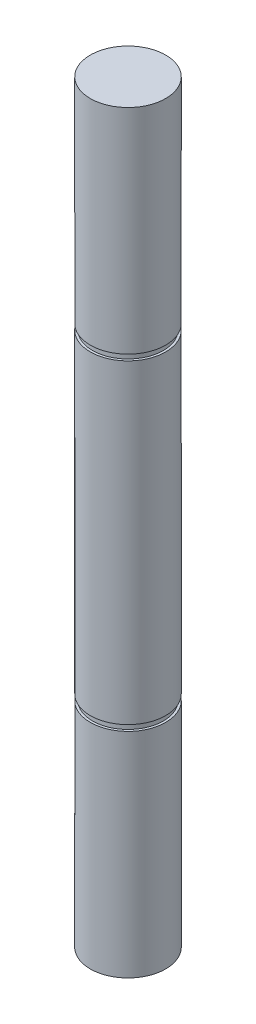
ISO-10303-21;
HEADER;
FILE_DESCRIPTION(('STEP AP214'),'2;1');
FILE_NAME('part.step','',(''),(''),'','','');
FILE_SCHEMA(('AUTOMOTIVE_DESIGN { 1 0 10303 214 1 1 1 1 }'));
ENDSEC;
DATA;
#1=APPLICATION_CONTEXT('core data for automotive mechanical design processes');
#2=APPLICATION_PROTOCOL_DEFINITION('international standard','automotive_design',2000,#1);
#3=PRODUCT_CONTEXT('',#1,'mechanical');
#4=PRODUCT('Part','Part','',(#3));
#5=PRODUCT_RELATED_PRODUCT_CATEGORY('part','',(#4));
#6=PRODUCT_DEFINITION_FORMATION('','',#4);
#7=PRODUCT_DEFINITION_CONTEXT('part definition',#1,'design');
#8=PRODUCT_DEFINITION('design','',#6,#7);
#9=PRODUCT_DEFINITION_SHAPE('','',#8);
#10=(LENGTH_UNIT() NAMED_UNIT(*) SI_UNIT(.MILLI.,.METRE.));
#11=(NAMED_UNIT(*) PLANE_ANGLE_UNIT() SI_UNIT($,.RADIAN.));
#12=(NAMED_UNIT(*) SI_UNIT($,.STERADIAN.) SOLID_ANGLE_UNIT());
#13=UNCERTAINTY_MEASURE_WITH_UNIT(LENGTH_MEASURE(1.E-05),#10,'distance_accuracy_value','');
#14=(GEOMETRIC_REPRESENTATION_CONTEXT(3) GLOBAL_UNCERTAINTY_ASSIGNED_CONTEXT((#13)) GLOBAL_UNIT_ASSIGNED_CONTEXT((#10,
#11,#12)) REPRESENTATION_CONTEXT('',''));
#15=CARTESIAN_POINT('',(0.,0.,0.));
#16=DIRECTION('',(0.,0.,1.));
#17=DIRECTION('',(1.,0.,0.));
#18=AXIS2_PLACEMENT_3D('',#15,#16,#17);
#19=CARTESIAN_POINT('',(0.,-95.25,0.));
#20=DIRECTION('',(0.,1.,0.));
#21=DIRECTION('',(0.,0.,1.));
#22=AXIS2_PLACEMENT_3D('',#19,#20,#21);
#23=CYLINDRICAL_SURFACE('',#22,4.7625);
#24=CARTESIAN_POINT('',(0.,-95.25,0.));
#25=DIRECTION('',(0.,1.,0.));
#26=DIRECTION('',(0.,0.,1.));
#27=AXIS2_PLACEMENT_3D('',#24,#25,#26);
#28=CIRCLE('',#27,4.7625);
#29=CARTESIAN_POINT('',(0.,-95.25,4.7625));
#30=VERTEX_POINT('',#29);
#31=EDGE_CURVE('E96',#30,#30,#28,.T.);
#32=ORIENTED_EDGE('',*,*,#31,.T.);
#33=EDGE_LOOP('',(#32));
#34=FACE_BOUND('',#33,.T.);
#35=CARTESIAN_POINT('',(0.,-68.2625,0.));
#36=DIRECTION('',(0.,1.,0.));
#37=DIRECTION('',(-1.,0.,0.));
#38=AXIS2_PLACEMENT_3D('',#35,#36,#37);
#39=CIRCLE('',#38,4.7625);
#40=CARTESIAN_POINT('',(-4.7625,-68.2624999999999,0.));
#41=VERTEX_POINT('',#40);
#42=EDGE_CURVE('E102',#41,#41,#39,.F.);
#43=ORIENTED_EDGE('',*,*,#42,.T.);
#44=EDGE_LOOP('',(#43));
#45=FACE_BOUND('',#44,.T.);
#46=ADVANCED_FACE('F73',(#34,#45),#23,.T.);
#47=CARTESIAN_POINT('',(0.,-95.25,0.));
#48=DIRECTION('',(0.,1.,0.));
#49=DIRECTION('',(0.,0.,1.));
#50=AXIS2_PLACEMENT_3D('',#47,#48,#49);
#51=PLANE('',#50);
#52=ORIENTED_EDGE('',*,*,#31,.F.);
#53=EDGE_LOOP('',(#52));
#54=FACE_BOUND('',#53,.T.);
#55=ADVANCED_FACE('F120',(#54),#51,.F.);
#56=CARTESIAN_POINT('',(-2.32535508070437E-13,-68.2625,0.));
#57=DIRECTION('',(0.,1.,0.));
#58=DIRECTION('',(-1.,0.,0.));
#59=AXIS2_PLACEMENT_3D('',#56,#57,#58);
#60=PLANE('',#59);
#61=CARTESIAN_POINT('',(0.,-68.2625,0.));
#62=DIRECTION('',(0.,1.,0.));
#63=DIRECTION('',(0.,0.,1.));
#64=AXIS2_PLACEMENT_3D('',#61,#62,#63);
#65=CIRCLE('',#64,4.47039999999978);
#66=CARTESIAN_POINT('',(0.,-68.2625,4.47039999999978));
#67=VERTEX_POINT('',#66);
#68=EDGE_CURVE('E106',#67,#67,#65,.T.);
#69=ORIENTED_EDGE('',*,*,#68,.F.);
#70=EDGE_LOOP('',(#69));
#71=FACE_BOUND('',#70,.T.);
#72=ORIENTED_EDGE('',*,*,#42,.F.);
#73=EDGE_LOOP('',(#72));
#74=FACE_BOUND('',#73,.T.);
#75=ADVANCED_FACE('F117',(#71,#74),#60,.T.);
#76=CARTESIAN_POINT('',(0.,-54.8816993815352,0.));
#77=DIRECTION('',(0.,-1.,0.));
#78=DIRECTION('',(0.,0.,-1.));
#79=AXIS2_PLACEMENT_3D('',#76,#77,#78);
#80=CYLINDRICAL_SURFACE('',#79,4.47039999999978);
#81=ORIENTED_EDGE('',*,*,#68,.T.);
#82=EDGE_LOOP('',(#81));
#83=FACE_BOUND('',#82,.T.);
#84=CARTESIAN_POINT('',(0.,-67.5259,0.));
#85=DIRECTION('',(0.,1.,0.));
#86=DIRECTION('',(-1.,0.,0.));
#87=AXIS2_PLACEMENT_3D('',#84,#85,#86);
#88=CIRCLE('',#87,4.47039999999978);
#89=CARTESIAN_POINT('',(-4.47039999999978,-67.5259,0.));
#90=VERTEX_POINT('',#89);
#91=EDGE_CURVE('E107',#90,#90,#88,.T.);
#92=ORIENTED_EDGE('',*,*,#91,.F.);
#93=EDGE_LOOP('',(#92));
#94=FACE_BOUND('',#93,.T.);
#95=ADVANCED_FACE('F114',(#83,#94),#80,.T.);
#96=CARTESIAN_POINT('',(0.,-95.25,0.));
#97=DIRECTION('',(0.,1.,0.));
#98=DIRECTION('',(0.,0.,1.));
#99=AXIS2_PLACEMENT_3D('',#96,#97,#98);
#100=CYLINDRICAL_SURFACE('',#99,4.7625);
#101=CARTESIAN_POINT('',(0.,-27.7241,0.));
#102=DIRECTION('',(0.,-1.,0.));
#103=DIRECTION('',(0.,0.,-1.));
#104=AXIS2_PLACEMENT_3D('',#101,#102,#103);
#105=CIRCLE('',#104,4.7625);
#106=CARTESIAN_POINT('',(0.,-27.7241,-4.7625));
#107=VERTEX_POINT('',#106);
#108=EDGE_CURVE('E82',#107,#107,#105,.F.);
#109=ORIENTED_EDGE('',*,*,#108,.F.);
#110=EDGE_LOOP('',(#109));
#111=FACE_BOUND('',#110,.T.);
#112=CARTESIAN_POINT('',(0.,-67.5259,0.));
#113=DIRECTION('',(0.,1.,0.));
#114=DIRECTION('',(-1.,0.,0.));
#115=AXIS2_PLACEMENT_3D('',#112,#113,#114);
#116=CIRCLE('',#115,4.7625);
#117=CARTESIAN_POINT('',(-4.7625,-67.5259,0.));
#118=VERTEX_POINT('',#117);
#119=EDGE_CURVE('E77',#118,#118,#116,.F.);
#120=ORIENTED_EDGE('',*,*,#119,.F.);
#121=EDGE_LOOP('',(#120));
#122=FACE_BOUND('',#121,.T.);
#123=ADVANCED_FACE('F75',(#111,#122),#100,.T.);
#124=CARTESIAN_POINT('',(-2.32535508070437E-13,-67.5259,0.));
#125=DIRECTION('',(0.,1.,0.));
#126=DIRECTION('',(-1.,0.,0.));
#127=AXIS2_PLACEMENT_3D('',#124,#125,#126);
#128=PLANE('',#127);
#129=ORIENTED_EDGE('',*,*,#91,.T.);
#130=EDGE_LOOP('',(#129));
#131=FACE_BOUND('',#130,.T.);
#132=ORIENTED_EDGE('',*,*,#119,.T.);
#133=EDGE_LOOP('',(#132));
#134=FACE_BOUND('',#133,.T.);
#135=ADVANCED_FACE('F138',(#131,#134),#128,.F.);
#136=CARTESIAN_POINT('',(0.,-27.7241,0.));
#137=DIRECTION('',(0.,-1.,0.));
#138=DIRECTION('',(0.,0.,-1.));
#139=AXIS2_PLACEMENT_3D('',#136,#137,#138);
#140=PLANE('',#139);
#141=CARTESIAN_POINT('',(0.,-27.7241,0.));
#142=DIRECTION('',(0.,1.,0.));
#143=DIRECTION('',(0.,0.,1.));
#144=AXIS2_PLACEMENT_3D('',#141,#142,#143);
#145=CIRCLE('',#144,4.4704);
#146=CARTESIAN_POINT('',(0.,-27.7241,4.4704));
#147=VERTEX_POINT('',#146);
#148=EDGE_CURVE('E11',#147,#147,#145,.T.);
#149=ORIENTED_EDGE('',*,*,#148,.F.);
#150=EDGE_LOOP('',(#149));
#151=FACE_BOUND('',#150,.T.);
#152=ORIENTED_EDGE('',*,*,#108,.T.);
#153=EDGE_LOOP('',(#152));
#154=FACE_BOUND('',#153,.T.);
#155=ADVANCED_FACE('F140',(#151,#154),#140,.F.);
#156=CARTESIAN_POINT('',(0.,-14.3432993815346,0.));
#157=DIRECTION('',(0.,-1.,0.));
#158=DIRECTION('',(0.,0.,-1.));
#159=AXIS2_PLACEMENT_3D('',#156,#157,#158);
#160=CYLINDRICAL_SURFACE('',#159,4.4704);
#161=CARTESIAN_POINT('',(0.,-26.9875,0.));
#162=DIRECTION('',(0.,-1.,0.));
#163=DIRECTION('',(0.,0.,-1.));
#164=AXIS2_PLACEMENT_3D('',#161,#162,#163);
#165=CIRCLE('',#164,4.4704);
#166=CARTESIAN_POINT('',(0.,-26.9875,-4.4704));
#167=VERTEX_POINT('',#166);
#168=EDGE_CURVE('E93',#167,#167,#165,.T.);
#169=ORIENTED_EDGE('',*,*,#168,.T.);
#170=EDGE_LOOP('',(#169));
#171=FACE_BOUND('',#170,.T.);
#172=ORIENTED_EDGE('',*,*,#148,.T.);
#173=EDGE_LOOP('',(#172));
#174=FACE_BOUND('',#173,.T.);
#175=ADVANCED_FACE('F133',(#171,#174),#160,.T.);
#176=CARTESIAN_POINT('',(0.,0.,0.));
#177=DIRECTION('',(0.,1.,0.));
#178=DIRECTION('',(0.,0.,1.));
#179=AXIS2_PLACEMENT_3D('',#176,#177,#178);
#180=PLANE('',#179);
#181=CARTESIAN_POINT('',(0.,0.,0.));
#182=DIRECTION('',(0.,1.,0.));
#183=DIRECTION('',(0.,0.,1.));
#184=AXIS2_PLACEMENT_3D('',#181,#182,#183);
#185=CIRCLE('',#184,4.7625);
#186=CARTESIAN_POINT('',(0.,0.,4.7625));
#187=VERTEX_POINT('',#186);
#188=EDGE_CURVE('E97',#187,#187,#185,.T.);
#189=ORIENTED_EDGE('',*,*,#188,.T.);
#190=EDGE_LOOP('',(#189));
#191=FACE_BOUND('',#190,.T.);
#192=ADVANCED_FACE('F147',(#191),#180,.T.);
#193=CARTESIAN_POINT('',(0.,-95.25,0.));
#194=DIRECTION('',(0.,1.,0.));
#195=DIRECTION('',(0.,0.,1.));
#196=AXIS2_PLACEMENT_3D('',#193,#194,#195);
#197=CYLINDRICAL_SURFACE('',#196,4.7625);
#198=ORIENTED_EDGE('',*,*,#188,.F.);
#199=EDGE_LOOP('',(#198));
#200=FACE_BOUND('',#199,.T.);
#201=CARTESIAN_POINT('',(0.,-26.9875,0.));
#202=DIRECTION('',(0.,-1.,0.));
#203=DIRECTION('',(0.,0.,-1.));
#204=AXIS2_PLACEMENT_3D('',#201,#202,#203);
#205=CIRCLE('',#204,4.7625);
#206=CARTESIAN_POINT('',(0.,-26.9875,-4.7625));
#207=VERTEX_POINT('',#206);
#208=EDGE_CURVE('E91',#207,#207,#205,.F.);
#209=ORIENTED_EDGE('',*,*,#208,.T.);
#210=EDGE_LOOP('',(#209));
#211=FACE_BOUND('',#210,.T.);
#212=ADVANCED_FACE('F189',(#200,#211),#197,.T.);
#213=CARTESIAN_POINT('',(0.,-26.9875,0.));
#214=DIRECTION('',(0.,-1.,0.));
#215=DIRECTION('',(0.,0.,-1.));
#216=AXIS2_PLACEMENT_3D('',#213,#214,#215);
#217=PLANE('',#216);
#218=ORIENTED_EDGE('',*,*,#168,.F.);
#219=EDGE_LOOP('',(#218));
#220=FACE_BOUND('',#219,.T.);
#221=ORIENTED_EDGE('',*,*,#208,.F.);
#222=EDGE_LOOP('',(#221));
#223=FACE_BOUND('',#222,.T.);
#224=ADVANCED_FACE('F198',(#220,#223),#217,.T.);
#225=CLOSED_SHELL('',(#46,#55,#75,#95,#123,#135,#155,#175,#192,#212,#224));
#226=MANIFOLD_SOLID_BREP('B2',#225);
#227=ADVANCED_BREP_SHAPE_REPRESENTATION('',(#18,#226),#14);
#228=SHAPE_DEFINITION_REPRESENTATION(#9,#227);
ENDSEC;
END-ISO-10303-21;
